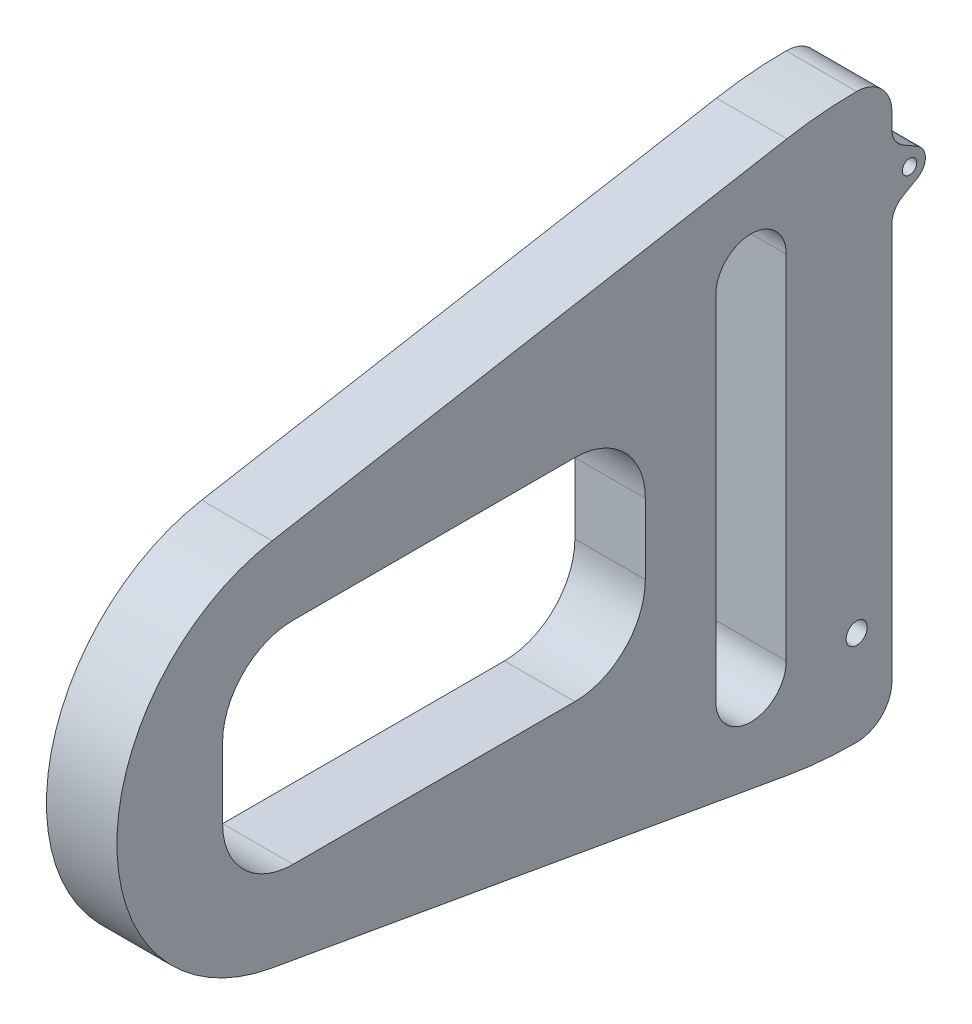
ISO-10303-21;
HEADER;
FILE_DESCRIPTION(('STEP AP214'),'2;1');
FILE_NAME('part.step','',(''),(''),'','','');
FILE_SCHEMA(('AUTOMOTIVE_DESIGN { 1 0 10303 214 1 1 1 1 }'));
ENDSEC;
DATA;
#1=APPLICATION_CONTEXT('core data for automotive mechanical design processes');
#2=APPLICATION_PROTOCOL_DEFINITION('international standard','automotive_design',2000,#1);
#3=PRODUCT_CONTEXT('',#1,'mechanical');
#4=PRODUCT('Part','Part','',(#3));
#5=PRODUCT_RELATED_PRODUCT_CATEGORY('part','',(#4));
#6=PRODUCT_DEFINITION_FORMATION('','',#4);
#7=PRODUCT_DEFINITION_CONTEXT('part definition',#1,'design');
#8=PRODUCT_DEFINITION('design','',#6,#7);
#9=PRODUCT_DEFINITION_SHAPE('','',#8);
#10=(LENGTH_UNIT() NAMED_UNIT(*) SI_UNIT(.MILLI.,.METRE.));
#11=(NAMED_UNIT(*) PLANE_ANGLE_UNIT() SI_UNIT($,.RADIAN.));
#12=(NAMED_UNIT(*) SI_UNIT($,.STERADIAN.) SOLID_ANGLE_UNIT());
#13=UNCERTAINTY_MEASURE_WITH_UNIT(LENGTH_MEASURE(1.E-05),#10,'distance_accuracy_value','');
#14=(GEOMETRIC_REPRESENTATION_CONTEXT(3) GLOBAL_UNCERTAINTY_ASSIGNED_CONTEXT((#13)) GLOBAL_UNIT_ASSIGNED_CONTEXT((#10,
#11,#12)) REPRESENTATION_CONTEXT('',''));
#15=CARTESIAN_POINT('',(0.,0.,0.));
#16=DIRECTION('',(0.,0.,1.));
#17=DIRECTION('',(1.,0.,0.));
#18=AXIS2_PLACEMENT_3D('',#15,#16,#17);
#19=CARTESIAN_POINT('',(-5.,17.,5.01314617902245));
#20=DIRECTION('',(1.,0.,0.));
#21=DIRECTION('',(0.,0.,-1.));
#22=AXIS2_PLACEMENT_3D('',#19,#20,#21);
#23=CYLINDRICAL_SURFACE('',#22,57.);
#24=DIRECTION('',(-1.,0.,0.));
#25=VECTOR('',#24,1.);
#26=CARTESIAN_POINT('',(-5.,-40.,5.01314617902245));
#27=LINE('',#26,#25);
#28=CARTESIAN_POINT('',(5.00000000000001,-40.,5.01314617902239));
#29=VERTEX_POINT('',#28);
#30=CARTESIAN_POINT('',(-4.99999999999999,-40.,5.01314617902239));
#31=VERTEX_POINT('',#30);
#32=EDGE_CURVE('E444',#29,#31,#27,.T.);
#33=ORIENTED_EDGE('',*,*,#32,.F.);
#34=CARTESIAN_POINT('',(5.,17.,5.01314617902245));
#35=DIRECTION('',(-1.,0.,0.));
#36=DIRECTION('',(0.,-1.,0.));
#37=AXIS2_PLACEMENT_3D('',#34,#35,#36);
#38=CIRCLE('',#37,57.);
#39=CARTESIAN_POINT('',(5.00000000000002,-39.1340419216959,14.9110923060373));
#40=VERTEX_POINT('',#39);
#41=EDGE_CURVE('E45',#40,#29,#38,.F.);
#42=ORIENTED_EDGE('',*,*,#41,.F.);
#43=DIRECTION('',(-1.,0.,0.));
#44=VECTOR('',#43,1.);
#45=CARTESIAN_POINT('',(-4.99999999999999,-39.1340419216959,14.9110923060373));
#46=LINE('',#45,#44);
#47=CARTESIAN_POINT('',(-4.99999999999999,-39.1340419216959,14.9110923060373));
#48=VERTEX_POINT('',#47);
#49=EDGE_CURVE('E447',#48,#40,#46,.F.);
#50=ORIENTED_EDGE('',*,*,#49,.F.);
#51=CARTESIAN_POINT('',(-5.,17.,5.01314617902245));
#52=DIRECTION('',(1.,0.,0.));
#53=DIRECTION('',(0.,1.,0.));
#54=AXIS2_PLACEMENT_3D('',#51,#52,#53);
#55=CIRCLE('',#54,57.);
#56=EDGE_CURVE('E12',#31,#48,#55,.F.);
#57=ORIENTED_EDGE('',*,*,#56,.F.);
#58=EDGE_LOOP('',(#33,#42,#50,#57));
#59=FACE_BOUND('',#58,.T.);
#60=ADVANCED_FACE('F38',(#59),#23,.T.);
#61=CARTESIAN_POINT('',(-5.,-17.,5.01314617902243));
#62=DIRECTION('',(-1.,0.,0.));
#63=DIRECTION('',(0.,0.,1.));
#64=AXIS2_PLACEMENT_3D('',#61,#62,#63);
#65=CYLINDRICAL_SURFACE('',#64,57.);
#66=DIRECTION('',(1.,0.,0.));
#67=VECTOR('',#66,1.);
#68=CARTESIAN_POINT('',(-5.,40.,5.01314617902243));
#69=LINE('',#68,#67);
#70=CARTESIAN_POINT('',(-5.,40.,5.01314617902239));
#71=VERTEX_POINT('',#70);
#72=CARTESIAN_POINT('',(5.,40.,5.01314617902239));
#73=VERTEX_POINT('',#72);
#74=EDGE_CURVE('E434',#71,#73,#69,.T.);
#75=ORIENTED_EDGE('',*,*,#74,.F.);
#76=CARTESIAN_POINT('',(-4.99999999999999,-17.,5.01314617902243));
#77=DIRECTION('',(1.,0.,0.));
#78=DIRECTION('',(0.,1.,0.));
#79=AXIS2_PLACEMENT_3D('',#76,#77,#78);
#80=CIRCLE('',#79,57.);
#81=CARTESIAN_POINT('',(-5.,39.1340419216959,14.9110923060373));
#82=VERTEX_POINT('',#81);
#83=EDGE_CURVE('E440',#82,#71,#80,.F.);
#84=ORIENTED_EDGE('',*,*,#83,.F.);
#85=DIRECTION('',(1.,0.,0.));
#86=VECTOR('',#85,1.);
#87=CARTESIAN_POINT('',(-5.00000000000001,39.1340419216959,14.9110923060373));
#88=LINE('',#87,#86);
#89=CARTESIAN_POINT('',(5.,39.1340419216959,14.9110923060373));
#90=VERTEX_POINT('',#89);
#91=EDGE_CURVE('E437',#90,#82,#88,.F.);
#92=ORIENTED_EDGE('',*,*,#91,.F.);
#93=CARTESIAN_POINT('',(5.,-17.,5.01314617902243));
#94=DIRECTION('',(-1.,0.,0.));
#95=DIRECTION('',(0.,-1.,0.));
#96=AXIS2_PLACEMENT_3D('',#93,#94,#95);
#97=CIRCLE('',#96,57.);
#98=EDGE_CURVE('E442',#73,#90,#97,.F.);
#99=ORIENTED_EDGE('',*,*,#98,.F.);
#100=EDGE_LOOP('',(#75,#84,#92,#99));
#101=FACE_BOUND('',#100,.T.);
#102=ADVANCED_FACE('F485',(#101),#65,.T.);
#103=CARTESIAN_POINT('',(0.,32.773502691896,-3.));
#104=DIRECTION('',(-1.,0.,0.));
#105=DIRECTION('',(0.,-1.,0.));
#106=AXIS2_PLACEMENT_3D('',#103,#104,#105);
#107=CYLINDRICAL_SURFACE('',#106,3.);
#108=DIRECTION('',(-1.,0.,0.));
#109=VECTOR('',#108,1.);
#110=CARTESIAN_POINT('',(0.,32.773502691896,0.));
#111=LINE('',#110,#109);
#112=CARTESIAN_POINT('',(5.,32.773502691896,0.));
#113=VERTEX_POINT('',#112);
#114=CARTESIAN_POINT('',(-5.,32.773502691896,0.));
#115=VERTEX_POINT('',#114);
#116=EDGE_CURVE('E406',#113,#115,#111,.T.);
#117=ORIENTED_EDGE('',*,*,#116,.F.);
#118=CARTESIAN_POINT('',(5.,32.773502691896,-3.));
#119=DIRECTION('',(-1.,0.,0.));
#120=DIRECTION('',(0.,-1.,0.));
#121=AXIS2_PLACEMENT_3D('',#118,#119,#120);
#122=CIRCLE('',#121,3.);
#123=CARTESIAN_POINT('',(5.,30.1754264805427,-1.50000000000001));
#124=VERTEX_POINT('',#123);
#125=EDGE_CURVE('E411',#113,#124,#122,.F.);
#126=ORIENTED_EDGE('',*,*,#125,.T.);
#127=DIRECTION('',(-1.,0.,0.));
#128=VECTOR('',#127,1.);
#129=CARTESIAN_POINT('',(-5.00000000000001,30.1754264805427,-1.50000000000001));
#130=LINE('',#129,#128);
#131=CARTESIAN_POINT('',(-5.00000000000001,30.1754264805427,-1.50000000000001));
#132=VERTEX_POINT('',#131);
#133=EDGE_CURVE('E409',#132,#124,#130,.F.);
#134=ORIENTED_EDGE('',*,*,#133,.F.);
#135=CARTESIAN_POINT('',(-5.,32.773502691896,-3.));
#136=DIRECTION('',(1.,0.,0.));
#137=DIRECTION('',(0.,1.,0.));
#138=AXIS2_PLACEMENT_3D('',#135,#136,#137);
#139=CIRCLE('',#138,3.);
#140=EDGE_CURVE('E239',#132,#115,#139,.F.);
#141=ORIENTED_EDGE('',*,*,#140,.T.);
#142=EDGE_LOOP('',(#117,#126,#134,#141));
#143=FACE_BOUND('',#142,.T.);
#144=ADVANCED_FACE('F489',(#143),#107,.F.);
#145=CARTESIAN_POINT('',(0.,21.2264973081035,-3.));
#146=DIRECTION('',(1.,0.,0.));
#147=DIRECTION('',(0.,1.,0.));
#148=AXIS2_PLACEMENT_3D('',#145,#146,#147);
#149=CYLINDRICAL_SURFACE('',#148,3.);
#150=DIRECTION('',(1.,0.,0.));
#151=VECTOR('',#150,1.);
#152=CARTESIAN_POINT('',(0.,21.2264973081035,0.));
#153=LINE('',#152,#151);
#154=CARTESIAN_POINT('',(-5.,21.2264973081035,0.));
#155=VERTEX_POINT('',#154);
#156=CARTESIAN_POINT('',(5.,21.2264973081035,0.));
#157=VERTEX_POINT('',#156);
#158=EDGE_CURVE('E395',#155,#157,#153,.T.);
#159=ORIENTED_EDGE('',*,*,#158,.F.);
#160=CARTESIAN_POINT('',(-5.,21.2264973081035,-3.));
#161=DIRECTION('',(1.,0.,0.));
#162=DIRECTION('',(0.,1.,0.));
#163=AXIS2_PLACEMENT_3D('',#160,#161,#162);
#164=CIRCLE('',#163,3.);
#165=CARTESIAN_POINT('',(-5.00000000000001,23.8245735194569,-1.50000000000001));
#166=VERTEX_POINT('',#165);
#167=EDGE_CURVE('E401',#155,#166,#164,.F.);
#168=ORIENTED_EDGE('',*,*,#167,.T.);
#169=DIRECTION('',(1.,0.,0.));
#170=VECTOR('',#169,1.);
#171=CARTESIAN_POINT('',(-5.00000000000001,23.8245735194569,-1.50000000000001));
#172=LINE('',#171,#170);
#173=CARTESIAN_POINT('',(5.,23.8245735194569,-1.50000000000001));
#174=VERTEX_POINT('',#173);
#175=EDGE_CURVE('E398',#174,#166,#172,.F.);
#176=ORIENTED_EDGE('',*,*,#175,.F.);
#177=CARTESIAN_POINT('',(5.,21.2264973081035,-3.));
#178=DIRECTION('',(-1.,0.,0.));
#179=DIRECTION('',(0.,-1.,0.));
#180=AXIS2_PLACEMENT_3D('',#177,#178,#179);
#181=CIRCLE('',#180,3.);
#182=EDGE_CURVE('E403',#174,#157,#181,.F.);
#183=ORIENTED_EDGE('',*,*,#182,.T.);
#184=EDGE_LOOP('',(#159,#168,#176,#183));
#185=FACE_BOUND('',#184,.T.);
#186=ADVANCED_FACE('F468',(#185),#149,.F.);
#187=CARTESIAN_POINT('',(0.,0.,0.));
#188=DIRECTION('',(0.,0.,1.));
#189=DIRECTION('',(1.,0.,0.));
#190=AXIS2_PLACEMENT_3D('',#187,#188,#189);
#191=PLANE('',#190);
#192=DIRECTION('',(0.,-1.,0.));
#193=VECTOR('',#192,1.);
#194=CARTESIAN_POINT('',(-5.,40.,0.));
#195=LINE('',#194,#193);
#196=CARTESIAN_POINT('',(-5.,35.,0.));
#197=VERTEX_POINT('',#196);
#198=EDGE_CURVE('E374',#197,#115,#195,.T.);
#199=ORIENTED_EDGE('',*,*,#198,.F.);
#200=DIRECTION('',(-1.,0.,0.));
#201=VECTOR('',#200,1.);
#202=CARTESIAN_POINT('',(0.,35.,0.));
#203=LINE('',#202,#201);
#204=CARTESIAN_POINT('',(5.,35.,0.));
#205=VERTEX_POINT('',#204);
#206=EDGE_CURVE('E432',#197,#205,#203,.F.);
#207=ORIENTED_EDGE('',*,*,#206,.T.);
#208=DIRECTION('',(0.,1.,0.));
#209=VECTOR('',#208,1.);
#210=CARTESIAN_POINT('',(5.,40.,0.));
#211=LINE('',#210,#209);
#212=EDGE_CURVE('E367',#113,#205,#211,.T.);
#213=ORIENTED_EDGE('',*,*,#212,.F.);
#214=ORIENTED_EDGE('',*,*,#116,.T.);
#215=EDGE_LOOP('',(#199,#207,#213,#214));
#216=FACE_BOUND('',#215,.T.);
#217=ADVANCED_FACE('F506',(#216),#191,.F.);
#218=CARTESIAN_POINT('',(5.00000000000001,0.,83.3436875692916));
#219=DIRECTION('',(-1.,0.,0.));
#220=DIRECTION('',(0.,-1.,0.));
#221=AXIS2_PLACEMENT_3D('',#218,#219,#220);
#222=CYLINDRICAL_SURFACE('',#221,26.6563124307084);
#223=DIRECTION('',(-1.,0.,0.));
#224=VECTOR('',#223,1.);
#225=CARTESIAN_POINT('',(5.00000000000001,-26.2513431484773,87.9725076462044));
#226=LINE('',#225,#224);
#227=CARTESIAN_POINT('',(5.00000000000001,-26.2513431484773,87.9725076462044));
#228=VERTEX_POINT('',#227);
#229=CARTESIAN_POINT('',(-4.99999999999999,-26.2513431484773,87.9725076462044));
#230=VERTEX_POINT('',#229);
#231=EDGE_CURVE('E384',#228,#230,#226,.T.);
#232=ORIENTED_EDGE('',*,*,#231,.F.);
#233=CARTESIAN_POINT('',(5.,0.,83.3436875692916));
#234=DIRECTION('',(-1.,0.,0.));
#235=DIRECTION('',(0.,-1.,0.));
#236=AXIS2_PLACEMENT_3D('',#233,#234,#235);
#237=CIRCLE('',#236,26.6563124307084);
#238=CARTESIAN_POINT('',(5.00000000000001,26.2513431484773,87.9725076462044));
#239=VERTEX_POINT('',#238);
#240=EDGE_CURVE('E390',#239,#228,#237,.F.);
#241=ORIENTED_EDGE('',*,*,#240,.F.);
#242=DIRECTION('',(-1.,0.,0.));
#243=VECTOR('',#242,1.);
#244=CARTESIAN_POINT('',(5.00000000000001,26.2513431484773,87.9725076462044));
#245=LINE('',#244,#243);
#246=CARTESIAN_POINT('',(-5.,26.2513431484773,87.9725076462044));
#247=VERTEX_POINT('',#246);
#248=EDGE_CURVE('E387',#247,#239,#245,.F.);
#249=ORIENTED_EDGE('',*,*,#248,.F.);
#250=CARTESIAN_POINT('',(-5.,0.,83.3436875692916));
#251=DIRECTION('',(1.,0.,0.));
#252=DIRECTION('',(0.,1.,0.));
#253=AXIS2_PLACEMENT_3D('',#250,#251,#252);
#254=CIRCLE('',#253,26.6563124307084);
#255=EDGE_CURVE('E393',#230,#247,#254,.F.);
#256=ORIENTED_EDGE('',*,*,#255,.F.);
#257=EDGE_LOOP('',(#232,#241,#249,#256));
#258=FACE_BOUND('',#257,.T.);
#259=ADVANCED_FACE('F508',(#258),#222,.T.);
#260=CARTESIAN_POINT('',(5.,40.,10.));
#261=DIRECTION('',(-1.,0.,0.));
#262=DIRECTION('',(0.,-1.,0.));
#263=AXIS2_PLACEMENT_3D('',#260,#261,#262);
#264=PLANE('',#263);
#265=DIRECTION('',(0.,0.173648177666927,0.984807753012209));
#266=VECTOR('',#265,1.);
#267=CARTESIAN_POINT('',(5.00000000000002,-40.,10.));
#268=LINE('',#267,#266);
#269=EDGE_CURVE('E361',#40,#228,#268,.T.);
#270=ORIENTED_EDGE('',*,*,#269,.F.);
#271=ORIENTED_EDGE('',*,*,#41,.T.);
#272=DIRECTION('',(0.,0.,-1.));
#273=VECTOR('',#272,1.);
#274=CARTESIAN_POINT('',(5.00000000000001,-40.,10.));
#275=LINE('',#274,#273);
#276=CARTESIAN_POINT('',(5.00000000000001,-40.,5.));
#277=VERTEX_POINT('',#276);
#278=EDGE_CURVE('E376',#29,#277,#275,.T.);
#279=ORIENTED_EDGE('',*,*,#278,.T.);
#280=CARTESIAN_POINT('',(5.00000000000001,-35.,5.));
#281=DIRECTION('',(-1.,0.,0.));
#282=DIRECTION('',(0.,-1.,0.));
#283=AXIS2_PLACEMENT_3D('',#280,#281,#282);
#284=CIRCLE('',#283,5.);
#285=CARTESIAN_POINT('',(5.00000000000001,-35.,0.));
#286=VERTEX_POINT('',#285);
#287=EDGE_CURVE('E420',#277,#286,#284,.F.);
#288=ORIENTED_EDGE('',*,*,#287,.T.);
#289=EDGE_CURVE('E371',#286,#157,#211,.T.);
#290=ORIENTED_EDGE('',*,*,#289,.T.);
#291=ORIENTED_EDGE('',*,*,#182,.F.);
#292=DIRECTION('',(0.,0.499999999999998,-0.86602540378444));
#293=VECTOR('',#292,1.);
#294=CARTESIAN_POINT('',(5.,25.0514428414848,-3.62499999999997));
#295=LINE('',#294,#293);
#296=CARTESIAN_POINT('',(5.,25.0514428414848,-3.62499999999997));
#297=VERTEX_POINT('',#296);
#298=EDGE_CURVE('E245',#174,#297,#295,.T.);
#299=ORIENTED_EDGE('',*,*,#298,.T.);
#300=CARTESIAN_POINT('',(5.,26.9999999999998,-2.49999999999997));
#301=DIRECTION('',(1.,0.,0.));
#302=DIRECTION('',(0.,1.,0.));
#303=AXIS2_PLACEMENT_3D('',#300,#301,#302);
#304=CIRCLE('',#303,2.25);
#305=CARTESIAN_POINT('',(5.,28.9485571585148,-3.62499999999997));
#306=VERTEX_POINT('',#305);
#307=EDGE_CURVE('E253',#297,#306,#304,.T.);
#308=ORIENTED_EDGE('',*,*,#307,.T.);
#309=DIRECTION('',(0.,0.499999999999998,0.86602540378444));
#310=VECTOR('',#309,1.);
#311=CARTESIAN_POINT('',(5.,28.9485571585148,-3.62499999999997));
#312=LINE('',#311,#310);
#313=EDGE_CURVE('E225',#306,#124,#312,.T.);
#314=ORIENTED_EDGE('',*,*,#313,.T.);
#315=ORIENTED_EDGE('',*,*,#125,.F.);
#316=ORIENTED_EDGE('',*,*,#212,.T.);
#317=CARTESIAN_POINT('',(5.,35.,5.));
#318=DIRECTION('',(-1.,0.,0.));
#319=DIRECTION('',(0.,-1.,0.));
#320=AXIS2_PLACEMENT_3D('',#317,#318,#319);
#321=CIRCLE('',#320,5.);
#322=CARTESIAN_POINT('',(5.,40.,5.));
#323=VERTEX_POINT('',#322);
#324=EDGE_CURVE('E417',#205,#323,#321,.F.);
#325=ORIENTED_EDGE('',*,*,#324,.T.);
#326=DIRECTION('',(0.,0.,-1.));
#327=VECTOR('',#326,1.);
#328=CARTESIAN_POINT('',(5.,40.,10.));
#329=LINE('',#328,#327);
#330=EDGE_CURVE('E382',#73,#323,#329,.T.);
#331=ORIENTED_EDGE('',*,*,#330,.F.);
#332=ORIENTED_EDGE('',*,*,#98,.T.);
#333=DIRECTION('',(0.,0.173648177666927,-0.984807753012209));
#334=VECTOR('',#333,1.);
#335=CARTESIAN_POINT('',(5.,40.,10.));
#336=LINE('',#335,#334);
#337=EDGE_CURVE('E363',#239,#90,#336,.T.);
#338=ORIENTED_EDGE('',*,*,#337,.F.);
#339=ORIENTED_EDGE('',*,*,#240,.T.);
#340=EDGE_LOOP('',(#270,#271,#279,#288,#290,#291,#299,#308,#314,#315,#316,#325,#331,#332,#338,#339));
#341=FACE_BOUND('',#340,.T.);
#342=CARTESIAN_POINT('',(5.,-26.5786613547533,4.99999999999997));
#343=DIRECTION('',(1.,0.,0.));
#344=DIRECTION('',(0.,1.,0.));
#345=AXIS2_PLACEMENT_3D('',#342,#343,#344);
#346=CIRCLE('',#345,1.5);
#347=CARTESIAN_POINT('',(5.,-25.0786613547533,4.99999999999997));
#348=VERTEX_POINT('',#347);
#349=EDGE_CURVE('E257',#348,#348,#346,.T.);
#350=ORIENTED_EDGE('',*,*,#349,.F.);
#351=EDGE_LOOP('',(#350));
#352=FACE_BOUND('',#351,.T.);
#353=DIRECTION('',(0.,0.,1.));
#354=VECTOR('',#353,1.);
#355=CARTESIAN_POINT('',(5.00000000000001,-15.,45.));
#356=LINE('',#355,#354);
#357=CARTESIAN_POINT('',(5.00000000000001,-15.,45.));
#358=VERTEX_POINT('',#357);
#359=CARTESIAN_POINT('',(5.00000000000001,-15.,85.));
#360=VERTEX_POINT('',#359);
#361=EDGE_CURVE('E287',#358,#360,#356,.T.);
#362=ORIENTED_EDGE('',*,*,#361,.T.);
#363=CARTESIAN_POINT('',(5.00000000000001,-5.,85.));
#364=DIRECTION('',(-1.,0.,0.));
#365=DIRECTION('',(0.,-1.,0.));
#366=AXIS2_PLACEMENT_3D('',#363,#364,#365);
#367=CIRCLE('',#366,9.99999999999999);
#368=CARTESIAN_POINT('',(5.00000000000001,-5.,95.));
#369=VERTEX_POINT('',#368);
#370=EDGE_CURVE('E265',#360,#369,#367,.T.);
#371=ORIENTED_EDGE('',*,*,#370,.T.);
#372=DIRECTION('',(0.,1.,0.));
#373=VECTOR('',#372,1.);
#374=CARTESIAN_POINT('',(5.00000000000001,5.,95.));
#375=LINE('',#374,#373);
#376=CARTESIAN_POINT('',(5.00000000000001,5.,95.));
#377=VERTEX_POINT('',#376);
#378=EDGE_CURVE('E268',#369,#377,#375,.T.);
#379=ORIENTED_EDGE('',*,*,#378,.T.);
#380=CARTESIAN_POINT('',(5.00000000000001,5.,85.));
#381=DIRECTION('',(-1.,0.,0.));
#382=DIRECTION('',(0.,1.,0.));
#383=AXIS2_PLACEMENT_3D('',#380,#381,#382);
#384=CIRCLE('',#383,9.99999999999999);
#385=CARTESIAN_POINT('',(5.00000000000001,15.,85.));
#386=VERTEX_POINT('',#385);
#387=EDGE_CURVE('E272',#377,#386,#384,.T.);
#388=ORIENTED_EDGE('',*,*,#387,.T.);
#389=DIRECTION('',(0.,0.,-1.));
#390=VECTOR('',#389,1.);
#391=CARTESIAN_POINT('',(5.00000000000001,15.,45.));
#392=LINE('',#391,#390);
#393=CARTESIAN_POINT('',(5.00000000000001,15.,45.));
#394=VERTEX_POINT('',#393);
#395=EDGE_CURVE('E275',#386,#394,#392,.T.);
#396=ORIENTED_EDGE('',*,*,#395,.T.);
#397=CARTESIAN_POINT('',(5.00000000000001,5.,45.));
#398=DIRECTION('',(-1.,0.,0.));
#399=DIRECTION('',(0.,-1.,0.));
#400=AXIS2_PLACEMENT_3D('',#397,#398,#399);
#401=CIRCLE('',#400,10.);
#402=CARTESIAN_POINT('',(5.00000000000001,5.,35.));
#403=VERTEX_POINT('',#402);
#404=EDGE_CURVE('E278',#394,#403,#401,.T.);
#405=ORIENTED_EDGE('',*,*,#404,.T.);
#406=DIRECTION('',(0.,-1.,0.));
#407=VECTOR('',#406,1.);
#408=CARTESIAN_POINT('',(5.00000000000001,5.,35.));
#409=LINE('',#408,#407);
#410=CARTESIAN_POINT('',(5.00000000000001,-5.,35.));
#411=VERTEX_POINT('',#410);
#412=EDGE_CURVE('E281',#403,#411,#409,.T.);
#413=ORIENTED_EDGE('',*,*,#412,.T.);
#414=CARTESIAN_POINT('',(5.00000000000001,-5.,45.));
#415=DIRECTION('',(-1.,0.,0.));
#416=DIRECTION('',(0.,-1.,0.));
#417=AXIS2_PLACEMENT_3D('',#414,#415,#416);
#418=CIRCLE('',#417,10.);
#419=EDGE_CURVE('E284',#411,#358,#418,.T.);
#420=ORIENTED_EDGE('',*,*,#419,.T.);
#421=EDGE_LOOP('',(#362,#371,#379,#388,#396,#405,#413,#420));
#422=FACE_BOUND('',#421,.T.);
#423=DIRECTION('',(0.,1.,0.));
#424=VECTOR('',#423,1.);
#425=CARTESIAN_POINT('',(5.00000000000001,25.,25.));
#426=LINE('',#425,#424);
#427=CARTESIAN_POINT('',(5.00000000000001,-25.,25.));
#428=VERTEX_POINT('',#427);
#429=CARTESIAN_POINT('',(5.00000000000001,25.,25.));
#430=VERTEX_POINT('',#429);
#431=EDGE_CURVE('E339',#428,#430,#426,.T.);
#432=ORIENTED_EDGE('',*,*,#431,.T.);
#433=CARTESIAN_POINT('',(5.00000000000001,25.,20.));
#434=DIRECTION('',(-1.,0.,0.));
#435=DIRECTION('',(0.,-1.,0.));
#436=AXIS2_PLACEMENT_3D('',#433,#434,#435);
#437=CIRCLE('',#436,5.);
#438=CARTESIAN_POINT('',(5.00000000000001,25.,15.));
#439=VERTEX_POINT('',#438);
#440=EDGE_CURVE('E329',#430,#439,#437,.T.);
#441=ORIENTED_EDGE('',*,*,#440,.T.);
#442=DIRECTION('',(0.,-1.,0.));
#443=VECTOR('',#442,1.);
#444=CARTESIAN_POINT('',(5.00000000000001,25.,15.));
#445=LINE('',#444,#443);
#446=CARTESIAN_POINT('',(5.00000000000001,-25.,15.));
#447=VERTEX_POINT('',#446);
#448=EDGE_CURVE('E332',#439,#447,#445,.T.);
#449=ORIENTED_EDGE('',*,*,#448,.T.);
#450=CARTESIAN_POINT('',(5.00000000000001,-25.,20.));
#451=DIRECTION('',(-1.,0.,0.));
#452=DIRECTION('',(0.,-1.,0.));
#453=AXIS2_PLACEMENT_3D('',#450,#451,#452);
#454=CIRCLE('',#453,5.);
#455=EDGE_CURVE('E336',#447,#428,#454,.T.);
#456=ORIENTED_EDGE('',*,*,#455,.T.);
#457=EDGE_LOOP('',(#432,#441,#449,#456));
#458=FACE_BOUND('',#457,.T.);
#459=CARTESIAN_POINT('',(5.,26.9999999999998,-2.49999999999997));
#460=DIRECTION('',(1.,0.,0.));
#461=DIRECTION('',(0.,1.,0.));
#462=AXIS2_PLACEMENT_3D('',#459,#460,#461);
#463=CIRCLE('',#462,1.025);
#464=CARTESIAN_POINT('',(5.,28.0249999999998,-2.49999999999997));
#465=VERTEX_POINT('',#464);
#466=EDGE_CURVE('E249',#465,#465,#463,.T.);
#467=ORIENTED_EDGE('',*,*,#466,.F.);
#468=EDGE_LOOP('',(#467));
#469=FACE_BOUND('',#468,.T.);
#470=ADVANCED_FACE('F450',(#341,#352,#422,#458,#469),#264,.F.);
#471=CARTESIAN_POINT('',(-5.,40.,10.));
#472=DIRECTION('',(0.,-1.,0.));
#473=DIRECTION('',(0.,0.,-1.));
#474=AXIS2_PLACEMENT_3D('',#471,#472,#473);
#475=PLANE('',#474);
#476=DIRECTION('',(0.,0.,-1.));
#477=VECTOR('',#476,1.);
#478=CARTESIAN_POINT('',(-5.,40.,10.));
#479=LINE('',#478,#477);
#480=CARTESIAN_POINT('',(-5.,40.,5.));
#481=VERTEX_POINT('',#480);
#482=EDGE_CURVE('E380',#71,#481,#479,.T.);
#483=ORIENTED_EDGE('',*,*,#482,.F.);
#484=ORIENTED_EDGE('',*,*,#74,.T.);
#485=ORIENTED_EDGE('',*,*,#330,.T.);
#486=DIRECTION('',(-1.,0.,0.));
#487=VECTOR('',#486,1.);
#488=CARTESIAN_POINT('',(-5.,40.,5.));
#489=LINE('',#488,#487);
#490=EDGE_CURVE('E429',#323,#481,#489,.T.);
#491=ORIENTED_EDGE('',*,*,#490,.T.);
#492=EDGE_LOOP('',(#483,#484,#485,#491));
#493=FACE_BOUND('',#492,.T.);
#494=ADVANCED_FACE('F516',(#493),#475,.F.);
#495=CARTESIAN_POINT('',(-5.,40.,10.));
#496=DIRECTION('',(1.,0.,0.));
#497=DIRECTION('',(0.,1.,0.));
#498=AXIS2_PLACEMENT_3D('',#495,#496,#497);
#499=PLANE('',#498);
#500=DIRECTION('',(0.,0.,-1.));
#501=VECTOR('',#500,1.);
#502=CARTESIAN_POINT('',(-4.99999999999999,-40.,10.));
#503=LINE('',#502,#501);
#504=CARTESIAN_POINT('',(-4.99999999999999,-40.,5.));
#505=VERTEX_POINT('',#504);
#506=EDGE_CURVE('E378',#31,#505,#503,.T.);
#507=ORIENTED_EDGE('',*,*,#506,.F.);
#508=ORIENTED_EDGE('',*,*,#56,.T.);
#509=DIRECTION('',(0.,0.173648177666927,0.984807753012209));
#510=VECTOR('',#509,1.);
#511=CARTESIAN_POINT('',(-4.99999999999999,-40.,10.));
#512=LINE('',#511,#510);
#513=EDGE_CURVE('E354',#48,#230,#512,.T.);
#514=ORIENTED_EDGE('',*,*,#513,.T.);
#515=ORIENTED_EDGE('',*,*,#255,.T.);
#516=DIRECTION('',(0.,0.173648177666927,-0.984807753012209));
#517=VECTOR('',#516,1.);
#518=CARTESIAN_POINT('',(-5.,40.,10.));
#519=LINE('',#518,#517);
#520=EDGE_CURVE('E364',#247,#82,#519,.T.);
#521=ORIENTED_EDGE('',*,*,#520,.T.);
#522=ORIENTED_EDGE('',*,*,#83,.T.);
#523=ORIENTED_EDGE('',*,*,#482,.T.);
#524=CARTESIAN_POINT('',(-5.,35.,5.));
#525=DIRECTION('',(1.,0.,0.));
#526=DIRECTION('',(0.,1.,0.));
#527=AXIS2_PLACEMENT_3D('',#524,#525,#526);
#528=CIRCLE('',#527,5.);
#529=EDGE_CURVE('E424',#481,#197,#528,.F.);
#530=ORIENTED_EDGE('',*,*,#529,.T.);
#531=ORIENTED_EDGE('',*,*,#198,.T.);
#532=ORIENTED_EDGE('',*,*,#140,.F.);
#533=DIRECTION('',(0.,0.499999999999998,0.86602540378444));
#534=VECTOR('',#533,1.);
#535=CARTESIAN_POINT('',(-5.00000000000001,28.9485571585148,-3.62499999999997));
#536=LINE('',#535,#534);
#537=CARTESIAN_POINT('',(-5.00000000000001,28.9485571585148,-3.62499999999997));
#538=VERTEX_POINT('',#537);
#539=EDGE_CURVE('E223',#538,#132,#536,.T.);
#540=ORIENTED_EDGE('',*,*,#539,.F.);
#541=CARTESIAN_POINT('',(-5.00000000000001,26.9999999999998,-2.49999999999997));
#542=DIRECTION('',(1.,0.,0.));
#543=DIRECTION('',(0.,1.,0.));
#544=AXIS2_PLACEMENT_3D('',#541,#542,#543);
#545=CIRCLE('',#544,2.25);
#546=CARTESIAN_POINT('',(-5.00000000000001,25.0514428414848,-3.62499999999997));
#547=VERTEX_POINT('',#546);
#548=EDGE_CURVE('E237',#547,#538,#545,.T.);
#549=ORIENTED_EDGE('',*,*,#548,.F.);
#550=DIRECTION('',(0.,0.499999999999998,-0.86602540378444));
#551=VECTOR('',#550,1.);
#552=CARTESIAN_POINT('',(-5.00000000000001,25.0514428414848,-3.62499999999997));
#553=LINE('',#552,#551);
#554=EDGE_CURVE('E231',#166,#547,#553,.T.);
#555=ORIENTED_EDGE('',*,*,#554,.F.);
#556=ORIENTED_EDGE('',*,*,#167,.F.);
#557=CARTESIAN_POINT('',(-4.99999999999999,-35.,0.));
#558=VERTEX_POINT('',#557);
#559=EDGE_CURVE('E373',#155,#558,#195,.T.);
#560=ORIENTED_EDGE('',*,*,#559,.T.);
#561=CARTESIAN_POINT('',(-4.99999999999999,-35.,5.));
#562=DIRECTION('',(1.,0.,0.));
#563=DIRECTION('',(0.,1.,0.));
#564=AXIS2_PLACEMENT_3D('',#561,#562,#563);
#565=CIRCLE('',#564,5.);
#566=EDGE_CURVE('E426',#558,#505,#565,.F.);
#567=ORIENTED_EDGE('',*,*,#566,.T.);
#568=EDGE_LOOP('',(#507,#508,#514,#515,#521,#522,#523,#530,#531,#532,#540,#549,#555,#556,#560,#567));
#569=FACE_BOUND('',#568,.T.);
#570=CARTESIAN_POINT('',(-5.,-26.5786613547533,4.99999999999997));
#571=DIRECTION('',(1.,0.,0.));
#572=DIRECTION('',(0.,1.,0.));
#573=AXIS2_PLACEMENT_3D('',#570,#571,#572);
#574=CIRCLE('',#573,1.5);
#575=CARTESIAN_POINT('',(-5.,-25.0786613547533,4.99999999999997));
#576=VERTEX_POINT('',#575);
#577=EDGE_CURVE('E259',#576,#576,#574,.T.);
#578=ORIENTED_EDGE('',*,*,#577,.T.);
#579=EDGE_LOOP('',(#578));
#580=FACE_BOUND('',#579,.T.);
#581=CARTESIAN_POINT('',(-5.,-5.,85.));
#582=DIRECTION('',(-1.,0.,0.));
#583=DIRECTION('',(0.,-1.,0.));
#584=AXIS2_PLACEMENT_3D('',#581,#582,#583);
#585=CIRCLE('',#584,9.99999999999999);
#586=CARTESIAN_POINT('',(-5.,-15.,85.));
#587=VERTEX_POINT('',#586);
#588=CARTESIAN_POINT('',(-5.,-5.,95.));
#589=VERTEX_POINT('',#588);
#590=EDGE_CURVE('E262',#587,#589,#585,.T.);
#591=ORIENTED_EDGE('',*,*,#590,.F.);
#592=DIRECTION('',(0.,0.,1.));
#593=VECTOR('',#592,1.);
#594=CARTESIAN_POINT('',(-5.,-15.,45.));
#595=LINE('',#594,#593);
#596=CARTESIAN_POINT('',(-5.,-15.,45.));
#597=VERTEX_POINT('',#596);
#598=EDGE_CURVE('E269',#597,#587,#595,.T.);
#599=ORIENTED_EDGE('',*,*,#598,.F.);
#600=CARTESIAN_POINT('',(-5.,-5.,45.));
#601=DIRECTION('',(-1.,0.,0.));
#602=DIRECTION('',(0.,-1.,0.));
#603=AXIS2_PLACEMENT_3D('',#600,#601,#602);
#604=CIRCLE('',#603,10.);
#605=CARTESIAN_POINT('',(-5.,-5.,35.));
#606=VERTEX_POINT('',#605);
#607=EDGE_CURVE('E307',#606,#597,#604,.T.);
#608=ORIENTED_EDGE('',*,*,#607,.F.);
#609=DIRECTION('',(0.,-1.,0.));
#610=VECTOR('',#609,1.);
#611=CARTESIAN_POINT('',(-5.,5.,35.));
#612=LINE('',#611,#610);
#613=CARTESIAN_POINT('',(-5.,5.,35.));
#614=VERTEX_POINT('',#613);
#615=EDGE_CURVE('E304',#614,#606,#612,.T.);
#616=ORIENTED_EDGE('',*,*,#615,.F.);
#617=CARTESIAN_POINT('',(-5.,5.,45.));
#618=DIRECTION('',(-1.,0.,0.));
#619=DIRECTION('',(0.,-1.,0.));
#620=AXIS2_PLACEMENT_3D('',#617,#618,#619);
#621=CIRCLE('',#620,10.);
#622=CARTESIAN_POINT('',(-5.,15.,45.));
#623=VERTEX_POINT('',#622);
#624=EDGE_CURVE('E301',#623,#614,#621,.T.);
#625=ORIENTED_EDGE('',*,*,#624,.F.);
#626=DIRECTION('',(0.,0.,-1.));
#627=VECTOR('',#626,1.);
#628=CARTESIAN_POINT('',(-5.,15.,45.));
#629=LINE('',#628,#627);
#630=CARTESIAN_POINT('',(-5.,15.,85.));
#631=VERTEX_POINT('',#630);
#632=EDGE_CURVE('E298',#631,#623,#629,.T.);
#633=ORIENTED_EDGE('',*,*,#632,.F.);
#634=CARTESIAN_POINT('',(-5.,5.,85.));
#635=DIRECTION('',(-1.,0.,0.));
#636=DIRECTION('',(0.,1.,0.));
#637=AXIS2_PLACEMENT_3D('',#634,#635,#636);
#638=CIRCLE('',#637,9.99999999999999);
#639=CARTESIAN_POINT('',(-5.,5.,95.));
#640=VERTEX_POINT('',#639);
#641=EDGE_CURVE('E295',#640,#631,#638,.T.);
#642=ORIENTED_EDGE('',*,*,#641,.F.);
#643=DIRECTION('',(0.,1.,0.));
#644=VECTOR('',#643,1.);
#645=CARTESIAN_POINT('',(-5.,5.,95.));
#646=LINE('',#645,#644);
#647=EDGE_CURVE('E292',#589,#640,#646,.T.);
#648=ORIENTED_EDGE('',*,*,#647,.F.);
#649=EDGE_LOOP('',(#591,#599,#608,#616,#625,#633,#642,#648));
#650=FACE_BOUND('',#649,.T.);
#651=CARTESIAN_POINT('',(-5.,25.,20.));
#652=DIRECTION('',(-1.,0.,0.));
#653=DIRECTION('',(0.,-1.,0.));
#654=AXIS2_PLACEMENT_3D('',#651,#652,#653);
#655=CIRCLE('',#654,5.);
#656=CARTESIAN_POINT('',(-5.,25.,25.));
#657=VERTEX_POINT('',#656);
#658=CARTESIAN_POINT('',(-5.,25.,15.));
#659=VERTEX_POINT('',#658);
#660=EDGE_CURVE('E314',#657,#659,#655,.T.);
#661=ORIENTED_EDGE('',*,*,#660,.F.);
#662=DIRECTION('',(0.,1.,0.));
#663=VECTOR('',#662,1.);
#664=CARTESIAN_POINT('',(-5.,25.,25.));
#665=LINE('',#664,#663);
#666=CARTESIAN_POINT('',(-4.99999999999999,-25.,25.));
#667=VERTEX_POINT('',#666);
#668=EDGE_CURVE('E333',#667,#657,#665,.T.);
#669=ORIENTED_EDGE('',*,*,#668,.F.);
#670=CARTESIAN_POINT('',(-4.99999999999999,-25.,20.));
#671=DIRECTION('',(-1.,0.,0.));
#672=DIRECTION('',(0.,-1.,0.));
#673=AXIS2_PLACEMENT_3D('',#670,#671,#672);
#674=CIRCLE('',#673,5.);
#675=CARTESIAN_POINT('',(-4.99999999999999,-25.,15.));
#676=VERTEX_POINT('',#675);
#677=EDGE_CURVE('E347',#676,#667,#674,.T.);
#678=ORIENTED_EDGE('',*,*,#677,.F.);
#679=DIRECTION('',(0.,-1.,0.));
#680=VECTOR('',#679,1.);
#681=CARTESIAN_POINT('',(-5.,25.,15.));
#682=LINE('',#681,#680);
#683=EDGE_CURVE('E344',#659,#676,#682,.T.);
#684=ORIENTED_EDGE('',*,*,#683,.F.);
#685=EDGE_LOOP('',(#661,#669,#678,#684));
#686=FACE_BOUND('',#685,.T.);
#687=CARTESIAN_POINT('',(-5.00000000000001,26.9999999999998,-2.49999999999997));
#688=DIRECTION('',(1.,0.,0.));
#689=DIRECTION('',(0.,1.,0.));
#690=AXIS2_PLACEMENT_3D('',#687,#688,#689);
#691=CIRCLE('',#690,1.025);
#692=CARTESIAN_POINT('',(-5.00000000000001,28.0249999999998,-2.49999999999997));
#693=VERTEX_POINT('',#692);
#694=EDGE_CURVE('E255',#693,#693,#691,.T.);
#695=ORIENTED_EDGE('',*,*,#694,.T.);
#696=EDGE_LOOP('',(#695));
#697=FACE_BOUND('',#696,.T.);
#698=ADVANCED_FACE('F234',(#569,#580,#650,#686,#697),#499,.F.);
#699=CARTESIAN_POINT('',(-4.99999999999999,-40.,10.));
#700=DIRECTION('',(0.,1.,0.));
#701=DIRECTION('',(0.,0.,1.));
#702=AXIS2_PLACEMENT_3D('',#699,#700,#701);
#703=PLANE('',#702);
#704=ORIENTED_EDGE('',*,*,#278,.F.);
#705=ORIENTED_EDGE('',*,*,#32,.T.);
#706=ORIENTED_EDGE('',*,*,#506,.T.);
#707=DIRECTION('',(1.,0.,0.));
#708=VECTOR('',#707,1.);
#709=CARTESIAN_POINT('',(-4.99999999999999,-40.,5.));
#710=LINE('',#709,#708);
#711=EDGE_CURVE('E414',#505,#277,#710,.T.);
#712=ORIENTED_EDGE('',*,*,#711,.T.);
#713=EDGE_LOOP('',(#704,#705,#706,#712));
#714=FACE_BOUND('',#713,.T.);
#715=ADVANCED_FACE('F455',(#714),#703,.F.);
#716=ORIENTED_EDGE('',*,*,#289,.F.);
#717=DIRECTION('',(1.,0.,0.));
#718=VECTOR('',#717,1.);
#719=CARTESIAN_POINT('',(0.,-35.,0.));
#720=LINE('',#719,#718);
#721=EDGE_CURVE('E422',#286,#558,#720,.F.);
#722=ORIENTED_EDGE('',*,*,#721,.T.);
#723=ORIENTED_EDGE('',*,*,#559,.F.);
#724=ORIENTED_EDGE('',*,*,#158,.T.);
#725=EDGE_LOOP('',(#716,#722,#723,#724));
#726=FACE_BOUND('',#725,.T.);
#727=ADVANCED_FACE('F463',(#726),#191,.F.);
#728=CARTESIAN_POINT('',(5.,40.,10.));
#729=DIRECTION('',(0.,0.984807753012209,0.173648177666927));
#730=DIRECTION('',(0.,-0.173648177666927,0.984807753012209));
#731=AXIS2_PLACEMENT_3D('',#728,#729,#730);
#732=PLANE('',#731);
#733=ORIENTED_EDGE('',*,*,#337,.T.);
#734=ORIENTED_EDGE('',*,*,#91,.T.);
#735=ORIENTED_EDGE('',*,*,#520,.F.);
#736=ORIENTED_EDGE('',*,*,#248,.T.);
#737=EDGE_LOOP('',(#733,#734,#735,#736));
#738=FACE_BOUND('',#737,.T.);
#739=ADVANCED_FACE('F526',(#738),#732,.T.);
#740=CARTESIAN_POINT('',(5.00000000000002,-40.,10.));
#741=DIRECTION('',(0.,-0.984807753012209,0.173648177666927));
#742=DIRECTION('',(0.,-0.173648177666927,-0.984807753012209));
#743=AXIS2_PLACEMENT_3D('',#740,#741,#742);
#744=PLANE('',#743);
#745=ORIENTED_EDGE('',*,*,#513,.F.);
#746=ORIENTED_EDGE('',*,*,#49,.T.);
#747=ORIENTED_EDGE('',*,*,#269,.T.);
#748=ORIENTED_EDGE('',*,*,#231,.T.);
#749=EDGE_LOOP('',(#745,#746,#747,#748));
#750=FACE_BOUND('',#749,.T.);
#751=ADVANCED_FACE('F527',(#750),#744,.T.);
#752=CARTESIAN_POINT('',(5.00000000000001,25.,20.));
#753=DIRECTION('',(-1.,0.,0.));
#754=DIRECTION('',(0.,-1.,0.));
#755=AXIS2_PLACEMENT_3D('',#752,#753,#754);
#756=CYLINDRICAL_SURFACE('',#755,5.);
#757=ORIENTED_EDGE('',*,*,#660,.T.);
#758=DIRECTION('',(-1.,0.,0.));
#759=VECTOR('',#758,1.);
#760=CARTESIAN_POINT('',(5.00000000000001,25.,15.));
#761=LINE('',#760,#759);
#762=EDGE_CURVE('E342',#439,#659,#761,.T.);
#763=ORIENTED_EDGE('',*,*,#762,.F.);
#764=ORIENTED_EDGE('',*,*,#440,.F.);
#765=DIRECTION('',(-1.,0.,0.));
#766=VECTOR('',#765,1.);
#767=CARTESIAN_POINT('',(5.00000000000001,25.,25.));
#768=LINE('',#767,#766);
#769=EDGE_CURVE('E352',#430,#657,#768,.T.);
#770=ORIENTED_EDGE('',*,*,#769,.T.);
#771=EDGE_LOOP('',(#757,#763,#764,#770));
#772=FACE_BOUND('',#771,.T.);
#773=ADVANCED_FACE('F530',(#772),#756,.F.);
#774=CARTESIAN_POINT('',(5.00000000000001,25.,25.));
#775=DIRECTION('',(0.,0.,1.));
#776=DIRECTION('',(1.,0.,0.));
#777=AXIS2_PLACEMENT_3D('',#774,#775,#776);
#778=PLANE('',#777);
#779=ORIENTED_EDGE('',*,*,#668,.T.);
#780=ORIENTED_EDGE('',*,*,#769,.F.);
#781=ORIENTED_EDGE('',*,*,#431,.F.);
#782=DIRECTION('',(-1.,0.,0.));
#783=VECTOR('',#782,1.);
#784=CARTESIAN_POINT('',(5.00000000000001,-25.,25.));
#785=LINE('',#784,#783);
#786=EDGE_CURVE('E355',#428,#667,#785,.T.);
#787=ORIENTED_EDGE('',*,*,#786,.T.);
#788=EDGE_LOOP('',(#779,#780,#781,#787));
#789=FACE_BOUND('',#788,.T.);
#790=ADVANCED_FACE('F537',(#789),#778,.F.);
#791=CARTESIAN_POINT('',(5.00000000000001,-25.,20.));
#792=DIRECTION('',(-1.,0.,0.));
#793=DIRECTION('',(0.,-1.,0.));
#794=AXIS2_PLACEMENT_3D('',#791,#792,#793);
#795=CYLINDRICAL_SURFACE('',#794,5.);
#796=ORIENTED_EDGE('',*,*,#677,.T.);
#797=ORIENTED_EDGE('',*,*,#786,.F.);
#798=ORIENTED_EDGE('',*,*,#455,.F.);
#799=DIRECTION('',(-1.,0.,0.));
#800=VECTOR('',#799,1.);
#801=CARTESIAN_POINT('',(5.00000000000001,-25.,15.));
#802=LINE('',#801,#800);
#803=EDGE_CURVE('E357',#447,#676,#802,.T.);
#804=ORIENTED_EDGE('',*,*,#803,.T.);
#805=EDGE_LOOP('',(#796,#797,#798,#804));
#806=FACE_BOUND('',#805,.T.);
#807=ADVANCED_FACE('F543',(#806),#795,.F.);
#808=CARTESIAN_POINT('',(5.00000000000001,25.,15.));
#809=DIRECTION('',(0.,0.,-1.));
#810=DIRECTION('',(-1.,0.,0.));
#811=AXIS2_PLACEMENT_3D('',#808,#809,#810);
#812=PLANE('',#811);
#813=ORIENTED_EDGE('',*,*,#683,.T.);
#814=ORIENTED_EDGE('',*,*,#803,.F.);
#815=ORIENTED_EDGE('',*,*,#448,.F.);
#816=ORIENTED_EDGE('',*,*,#762,.T.);
#817=EDGE_LOOP('',(#813,#814,#815,#816));
#818=FACE_BOUND('',#817,.T.);
#819=ADVANCED_FACE('F539',(#818),#812,.F.);
#820=CARTESIAN_POINT('',(5.00000000000001,-5.,85.));
#821=DIRECTION('',(-1.,0.,0.));
#822=DIRECTION('',(0.,-1.,0.));
#823=AXIS2_PLACEMENT_3D('',#820,#821,#822);
#824=CYLINDRICAL_SURFACE('',#823,9.99999999999999);
#825=ORIENTED_EDGE('',*,*,#590,.T.);
#826=DIRECTION('',(-1.,0.,0.));
#827=VECTOR('',#826,1.);
#828=CARTESIAN_POINT('',(5.00000000000001,-5.,95.));
#829=LINE('',#828,#827);
#830=EDGE_CURVE('E290',#369,#589,#829,.T.);
#831=ORIENTED_EDGE('',*,*,#830,.F.);
#832=ORIENTED_EDGE('',*,*,#370,.F.);
#833=DIRECTION('',(-1.,0.,0.));
#834=VECTOR('',#833,1.);
#835=CARTESIAN_POINT('',(5.00000000000001,-15.,85.));
#836=LINE('',#835,#834);
#837=EDGE_CURVE('E312',#360,#587,#836,.T.);
#838=ORIENTED_EDGE('',*,*,#837,.T.);
#839=EDGE_LOOP('',(#825,#831,#832,#838));
#840=FACE_BOUND('',#839,.T.);
#841=ADVANCED_FACE('F542',(#840),#824,.F.);
#842=CARTESIAN_POINT('',(5.00000000000001,-15.,45.));
#843=DIRECTION('',(0.,-1.,0.));
#844=DIRECTION('',(1.,0.,0.));
#845=AXIS2_PLACEMENT_3D('',#842,#843,#844);
#846=PLANE('',#845);
#847=ORIENTED_EDGE('',*,*,#598,.T.);
#848=ORIENTED_EDGE('',*,*,#837,.F.);
#849=ORIENTED_EDGE('',*,*,#361,.F.);
#850=DIRECTION('',(-1.,0.,0.));
#851=VECTOR('',#850,1.);
#852=CARTESIAN_POINT('',(5.00000000000001,-15.,45.));
#853=LINE('',#852,#851);
#854=EDGE_CURVE('E315',#358,#597,#853,.T.);
#855=ORIENTED_EDGE('',*,*,#854,.T.);
#856=EDGE_LOOP('',(#847,#848,#849,#855));
#857=FACE_BOUND('',#856,.T.);
#858=ADVANCED_FACE('F553',(#857),#846,.F.);
#859=CARTESIAN_POINT('',(5.00000000000001,-5.,45.));
#860=DIRECTION('',(-1.,0.,0.));
#861=DIRECTION('',(0.,-1.,0.));
#862=AXIS2_PLACEMENT_3D('',#859,#860,#861);
#863=CYLINDRICAL_SURFACE('',#862,10.);
#864=ORIENTED_EDGE('',*,*,#607,.T.);
#865=ORIENTED_EDGE('',*,*,#854,.F.);
#866=ORIENTED_EDGE('',*,*,#419,.F.);
#867=DIRECTION('',(-1.,0.,0.));
#868=VECTOR('',#867,1.);
#869=CARTESIAN_POINT('',(5.00000000000001,-5.,35.));
#870=LINE('',#869,#868);
#871=EDGE_CURVE('E317',#411,#606,#870,.T.);
#872=ORIENTED_EDGE('',*,*,#871,.T.);
#873=EDGE_LOOP('',(#864,#865,#866,#872));
#874=FACE_BOUND('',#873,.T.);
#875=ADVANCED_FACE('F574',(#874),#863,.F.);
#876=CARTESIAN_POINT('',(5.00000000000001,5.,35.));
#877=DIRECTION('',(0.,0.,-1.));
#878=DIRECTION('',(-1.,0.,0.));
#879=AXIS2_PLACEMENT_3D('',#876,#877,#878);
#880=PLANE('',#879);
#881=ORIENTED_EDGE('',*,*,#615,.T.);
#882=ORIENTED_EDGE('',*,*,#871,.F.);
#883=ORIENTED_EDGE('',*,*,#412,.F.);
#884=DIRECTION('',(-1.,0.,0.));
#885=VECTOR('',#884,1.);
#886=CARTESIAN_POINT('',(5.00000000000001,5.,35.));
#887=LINE('',#886,#885);
#888=EDGE_CURVE('E319',#403,#614,#887,.T.);
#889=ORIENTED_EDGE('',*,*,#888,.T.);
#890=EDGE_LOOP('',(#881,#882,#883,#889));
#891=FACE_BOUND('',#890,.T.);
#892=ADVANCED_FACE('F570',(#891),#880,.F.);
#893=CARTESIAN_POINT('',(5.00000000000001,5.,45.));
#894=DIRECTION('',(-1.,0.,0.));
#895=DIRECTION('',(0.,-1.,0.));
#896=AXIS2_PLACEMENT_3D('',#893,#894,#895);
#897=CYLINDRICAL_SURFACE('',#896,10.);
#898=ORIENTED_EDGE('',*,*,#624,.T.);
#899=ORIENTED_EDGE('',*,*,#888,.F.);
#900=ORIENTED_EDGE('',*,*,#404,.F.);
#901=DIRECTION('',(-1.,0.,0.));
#902=VECTOR('',#901,1.);
#903=CARTESIAN_POINT('',(5.00000000000001,15.,45.));
#904=LINE('',#903,#902);
#905=EDGE_CURVE('E321',#394,#623,#904,.T.);
#906=ORIENTED_EDGE('',*,*,#905,.T.);
#907=EDGE_LOOP('',(#898,#899,#900,#906));
#908=FACE_BOUND('',#907,.T.);
#909=ADVANCED_FACE('F566',(#908),#897,.F.);
#910=CARTESIAN_POINT('',(5.00000000000001,15.,45.));
#911=DIRECTION('',(0.,1.,0.));
#912=DIRECTION('',(-1.,0.,0.));
#913=AXIS2_PLACEMENT_3D('',#910,#911,#912);
#914=PLANE('',#913);
#915=ORIENTED_EDGE('',*,*,#632,.T.);
#916=ORIENTED_EDGE('',*,*,#905,.F.);
#917=ORIENTED_EDGE('',*,*,#395,.F.);
#918=DIRECTION('',(-1.,0.,0.));
#919=VECTOR('',#918,1.);
#920=CARTESIAN_POINT('',(5.00000000000001,15.,85.));
#921=LINE('',#920,#919);
#922=EDGE_CURVE('E323',#386,#631,#921,.T.);
#923=ORIENTED_EDGE('',*,*,#922,.T.);
#924=EDGE_LOOP('',(#915,#916,#917,#923));
#925=FACE_BOUND('',#924,.T.);
#926=ADVANCED_FACE('F562',(#925),#914,.F.);
#927=CARTESIAN_POINT('',(5.00000000000001,5.,85.));
#928=DIRECTION('',(-1.,0.,0.));
#929=DIRECTION('',(0.,-1.,0.));
#930=AXIS2_PLACEMENT_3D('',#927,#928,#929);
#931=CYLINDRICAL_SURFACE('',#930,9.99999999999999);
#932=ORIENTED_EDGE('',*,*,#641,.T.);
#933=ORIENTED_EDGE('',*,*,#922,.F.);
#934=ORIENTED_EDGE('',*,*,#387,.F.);
#935=DIRECTION('',(-1.,0.,0.));
#936=VECTOR('',#935,1.);
#937=CARTESIAN_POINT('',(5.00000000000001,5.,95.));
#938=LINE('',#937,#936);
#939=EDGE_CURVE('E325',#377,#640,#938,.T.);
#940=ORIENTED_EDGE('',*,*,#939,.T.);
#941=EDGE_LOOP('',(#932,#933,#934,#940));
#942=FACE_BOUND('',#941,.T.);
#943=ADVANCED_FACE('F558',(#942),#931,.F.);
#944=CARTESIAN_POINT('',(5.00000000000001,5.,95.));
#945=DIRECTION('',(0.,0.,1.));
#946=DIRECTION('',(1.,0.,0.));
#947=AXIS2_PLACEMENT_3D('',#944,#945,#946);
#948=PLANE('',#947);
#949=ORIENTED_EDGE('',*,*,#647,.T.);
#950=ORIENTED_EDGE('',*,*,#939,.F.);
#951=ORIENTED_EDGE('',*,*,#378,.F.);
#952=ORIENTED_EDGE('',*,*,#830,.T.);
#953=EDGE_LOOP('',(#949,#950,#951,#952));
#954=FACE_BOUND('',#953,.T.);
#955=ADVANCED_FACE('F555',(#954),#948,.F.);
#956=CARTESIAN_POINT('',(-5.,-26.5786613547533,4.99999999999997));
#957=DIRECTION('',(1.,0.,0.));
#958=DIRECTION('',(0.,1.,0.));
#959=AXIS2_PLACEMENT_3D('',#956,#957,#958);
#960=CYLINDRICAL_SURFACE('',#959,1.5);
#961=ORIENTED_EDGE('',*,*,#577,.F.);
#962=EDGE_LOOP('',(#961));
#963=FACE_BOUND('',#962,.T.);
#964=ORIENTED_EDGE('',*,*,#349,.T.);
#965=EDGE_LOOP('',(#964));
#966=FACE_BOUND('',#965,.T.);
#967=ADVANCED_FACE('F481',(#963,#966),#960,.F.);
#968=CARTESIAN_POINT('',(-5.00000000000001,26.9999999999998,-2.49999999999997));
#969=DIRECTION('',(1.,0.,0.));
#970=DIRECTION('',(0.,1.,0.));
#971=AXIS2_PLACEMENT_3D('',#968,#969,#970);
#972=CYLINDRICAL_SURFACE('',#971,2.25);
#973=ORIENTED_EDGE('',*,*,#307,.F.);
#974=DIRECTION('',(1.,0.,0.));
#975=VECTOR('',#974,1.);
#976=CARTESIAN_POINT('',(-5.00000000000001,25.0514428414848,-3.62499999999997));
#977=LINE('',#976,#975);
#978=EDGE_CURVE('E230',#547,#297,#977,.T.);
#979=ORIENTED_EDGE('',*,*,#978,.F.);
#980=ORIENTED_EDGE('',*,*,#548,.T.);
#981=DIRECTION('',(1.,0.,0.));
#982=VECTOR('',#981,1.);
#983=CARTESIAN_POINT('',(-5.00000000000001,28.9485571585148,-3.62499999999997));
#984=LINE('',#983,#982);
#985=EDGE_CURVE('E219',#538,#306,#984,.T.);
#986=ORIENTED_EDGE('',*,*,#985,.T.);
#987=EDGE_LOOP('',(#973,#979,#980,#986));
#988=FACE_BOUND('',#987,.T.);
#989=ADVANCED_FACE('F243',(#988),#972,.T.);
#990=CARTESIAN_POINT('',(-5.00000000000001,25.0514428414848,-3.62499999999997));
#991=DIRECTION('',(0.,-0.86602540378444,-0.499999999999998));
#992=DIRECTION('',(0.,0.499999999999998,-0.86602540378444));
#993=AXIS2_PLACEMENT_3D('',#990,#991,#992);
#994=PLANE('',#993);
#995=ORIENTED_EDGE('',*,*,#298,.F.);
#996=ORIENTED_EDGE('',*,*,#175,.T.);
#997=ORIENTED_EDGE('',*,*,#554,.T.);
#998=ORIENTED_EDGE('',*,*,#978,.T.);
#999=EDGE_LOOP('',(#995,#996,#997,#998));
#1000=FACE_BOUND('',#999,.T.);
#1001=ADVANCED_FACE('F472',(#1000),#994,.T.);
#1002=CARTESIAN_POINT('',(-5.00000000000001,28.9485571585148,-3.62499999999997));
#1003=DIRECTION('',(0.,0.86602540378444,-0.499999999999998));
#1004=DIRECTION('',(0.,0.499999999999998,0.86602540378444));
#1005=AXIS2_PLACEMENT_3D('',#1002,#1003,#1004);
#1006=PLANE('',#1005);
#1007=ORIENTED_EDGE('',*,*,#539,.T.);
#1008=ORIENTED_EDGE('',*,*,#133,.T.);
#1009=ORIENTED_EDGE('',*,*,#313,.F.);
#1010=ORIENTED_EDGE('',*,*,#985,.F.);
#1011=EDGE_LOOP('',(#1007,#1008,#1009,#1010));
#1012=FACE_BOUND('',#1011,.T.);
#1013=ADVANCED_FACE('F221',(#1012),#1006,.T.);
#1014=CARTESIAN_POINT('',(-5.00000000000001,26.9999999999998,-2.49999999999997));
#1015=DIRECTION('',(1.,0.,0.));
#1016=DIRECTION('',(0.,1.,0.));
#1017=AXIS2_PLACEMENT_3D('',#1014,#1015,#1016);
#1018=CYLINDRICAL_SURFACE('',#1017,1.025);
#1019=ORIENTED_EDGE('',*,*,#694,.F.);
#1020=EDGE_LOOP('',(#1019));
#1021=FACE_BOUND('',#1020,.T.);
#1022=ORIENTED_EDGE('',*,*,#466,.T.);
#1023=EDGE_LOOP('',(#1022));
#1024=FACE_BOUND('',#1023,.T.);
#1025=ADVANCED_FACE('F479',(#1021,#1024),#1018,.F.);
#1026=CARTESIAN_POINT('',(-4.99999999999999,-35.,5.));
#1027=DIRECTION('',(1.,0.,0.));
#1028=DIRECTION('',(0.,0.,-1.));
#1029=AXIS2_PLACEMENT_3D('',#1026,#1027,#1028);
#1030=CYLINDRICAL_SURFACE('',#1029,5.);
#1031=ORIENTED_EDGE('',*,*,#566,.F.);
#1032=ORIENTED_EDGE('',*,*,#721,.F.);
#1033=ORIENTED_EDGE('',*,*,#287,.F.);
#1034=ORIENTED_EDGE('',*,*,#711,.F.);
#1035=EDGE_LOOP('',(#1031,#1032,#1033,#1034));
#1036=FACE_BOUND('',#1035,.T.);
#1037=ADVANCED_FACE('F459',(#1036),#1030,.T.);
#1038=CARTESIAN_POINT('',(-5.,35.,5.));
#1039=DIRECTION('',(-1.,0.,0.));
#1040=DIRECTION('',(0.,0.,1.));
#1041=AXIS2_PLACEMENT_3D('',#1038,#1039,#1040);
#1042=CYLINDRICAL_SURFACE('',#1041,5.);
#1043=ORIENTED_EDGE('',*,*,#324,.F.);
#1044=ORIENTED_EDGE('',*,*,#206,.F.);
#1045=ORIENTED_EDGE('',*,*,#529,.F.);
#1046=ORIENTED_EDGE('',*,*,#490,.F.);
#1047=EDGE_LOOP('',(#1043,#1044,#1045,#1046));
#1048=FACE_BOUND('',#1047,.T.);
#1049=ADVANCED_FACE('F498',(#1048),#1042,.T.);
#1050=CLOSED_SHELL('',(#60,#102,#144,#186,#217,#259,#470,#494,#698,#715,#727,#739,#751,#773,
#790,#807,#819,#841,#858,#875,#892,#909,#926,#943,#955,#967,#989,#1001,#1013,#1025,#1037,#1049));
#1051=MANIFOLD_SOLID_BREP('B2',#1050);
#1052=ADVANCED_BREP_SHAPE_REPRESENTATION('',(#18,#1051),#14);
#1053=SHAPE_DEFINITION_REPRESENTATION(#9,#1052);
ENDSEC;
END-ISO-10303-21;
